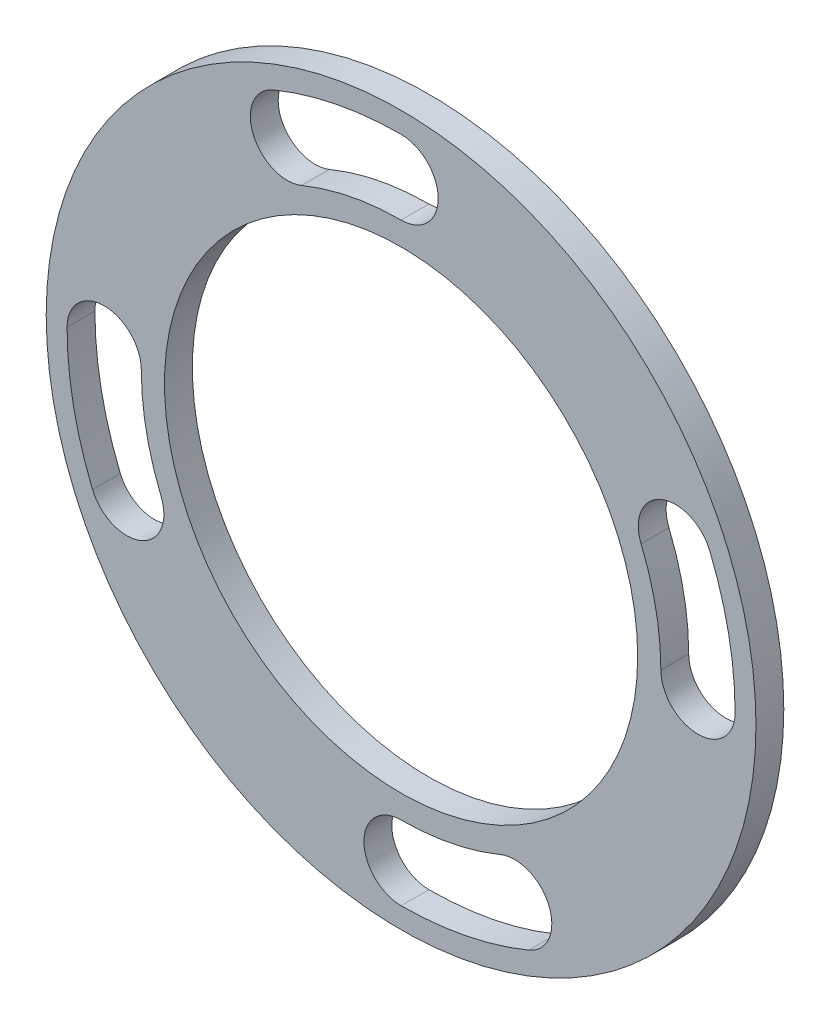
ISO-10303-21;
HEADER;
FILE_DESCRIPTION(('STEP AP214'),'2;1');
FILE_NAME('part.step','',(''),(''),'','','');
FILE_SCHEMA(('AUTOMOTIVE_DESIGN { 1 0 10303 214 1 1 1 1 }'));
ENDSEC;
DATA;
#1=APPLICATION_CONTEXT('core data for automotive mechanical design processes');
#2=APPLICATION_PROTOCOL_DEFINITION('international standard','automotive_design',2000,#1);
#3=PRODUCT_CONTEXT('',#1,'mechanical');
#4=PRODUCT('Part','Part','',(#3));
#5=PRODUCT_RELATED_PRODUCT_CATEGORY('part','',(#4));
#6=PRODUCT_DEFINITION_FORMATION('','',#4);
#7=PRODUCT_DEFINITION_CONTEXT('part definition',#1,'design');
#8=PRODUCT_DEFINITION('design','',#6,#7);
#9=PRODUCT_DEFINITION_SHAPE('','',#8);
#10=(LENGTH_UNIT() NAMED_UNIT(*) SI_UNIT(.MILLI.,.METRE.));
#11=(NAMED_UNIT(*) PLANE_ANGLE_UNIT() SI_UNIT($,.RADIAN.));
#12=(NAMED_UNIT(*) SI_UNIT($,.STERADIAN.) SOLID_ANGLE_UNIT());
#13=UNCERTAINTY_MEASURE_WITH_UNIT(LENGTH_MEASURE(1.E-05),#10,'distance_accuracy_value','');
#14=(GEOMETRIC_REPRESENTATION_CONTEXT(3) GLOBAL_UNCERTAINTY_ASSIGNED_CONTEXT((#13)) GLOBAL_UNIT_ASSIGNED_CONTEXT((#10,
#11,#12)) REPRESENTATION_CONTEXT('',''));
#15=CARTESIAN_POINT('',(0.,0.,0.));
#16=DIRECTION('',(0.,0.,1.));
#17=DIRECTION('',(1.,0.,0.));
#18=AXIS2_PLACEMENT_3D('',#15,#16,#17);
#19=CARTESIAN_POINT('',(0.,0.,0.6));
#20=DIRECTION('',(0.,0.,1.));
#21=DIRECTION('',(1.,0.,0.));
#22=AXIS2_PLACEMENT_3D('',#19,#20,#21);
#23=PLANE('',#22);
#24=CARTESIAN_POINT('',(0.,0.,0.6));
#25=DIRECTION('',(0.,0.,1.));
#26=DIRECTION('',(1.,0.,0.));
#27=AXIS2_PLACEMENT_3D('',#24,#25,#26);
#28=CIRCLE('',#27,7.65);
#29=CARTESIAN_POINT('',(7.65,0.,0.6));
#30=VERTEX_POINT('',#29);
#31=EDGE_CURVE('E11',#30,#30,#28,.T.);
#32=ORIENTED_EDGE('',*,*,#31,.T.);
#33=EDGE_LOOP('',(#32));
#34=FACE_BOUND('',#33,.T.);
#35=CARTESIAN_POINT('',(0.,0.,0.6));
#36=DIRECTION('',(0.,0.,1.));
#37=DIRECTION('',(1.,0.,0.));
#38=AXIS2_PLACEMENT_3D('',#35,#36,#37);
#39=CIRCLE('',#38,5.1);
#40=CARTESIAN_POINT('',(5.1,0.,0.6));
#41=VERTEX_POINT('',#40);
#42=EDGE_CURVE('E276',#41,#41,#39,.T.);
#43=ORIENTED_EDGE('',*,*,#42,.F.);
#44=EDGE_LOOP('',(#43));
#45=FACE_BOUND('',#44,.T.);
#46=CARTESIAN_POINT('',(0.,6.4,0.6));
#47=DIRECTION('',(0.,0.,1.));
#48=DIRECTION('',(1.,0.,0.));
#49=AXIS2_PLACEMENT_3D('',#46,#47,#48);
#50=CIRCLE('',#49,0.800000000000025);
#51=CARTESIAN_POINT('',(0.,5.59999999999997,0.6));
#52=VERTEX_POINT('',#51);
#53=CARTESIAN_POINT('',(0.,7.20000000000064,0.6));
#54=VERTEX_POINT('',#53);
#55=EDGE_CURVE('E247',#52,#54,#50,.T.);
#56=ORIENTED_EDGE('',*,*,#55,.F.);
#57=CARTESIAN_POINT('',(0.,0.,0.6));
#58=DIRECTION('',(0.,0.,-1.));
#59=DIRECTION('',(1.,0.,0.));
#60=AXIS2_PLACEMENT_3D('',#57,#58,#59);
#61=CIRCLE('',#60,5.60000000000057);
#62=CARTESIAN_POINT('',(-2.14302722124451,5.173725382063,0.6));
#63=VERTEX_POINT('',#62);
#64=EDGE_CURVE('E245',#63,#52,#61,.T.);
#65=ORIENTED_EDGE('',*,*,#64,.F.);
#66=CARTESIAN_POINT('',(-2.44917396713655,5.9128290080721,0.6));
#67=DIRECTION('',(0.,0.,1.));
#68=DIRECTION('',(1.,0.,0.));
#69=AXIS2_PLACEMENT_3D('',#66,#67,#68);
#70=CIRCLE('',#69,0.800000000000046);
#71=CARTESIAN_POINT('',(-2.75532071302869,6.65193263408115,0.6));
#72=VERTEX_POINT('',#71);
#73=EDGE_CURVE('E253',#72,#63,#70,.T.);
#74=ORIENTED_EDGE('',*,*,#73,.F.);
#75=CARTESIAN_POINT('',(0.,0.,0.6));
#76=DIRECTION('',(0.,0.,1.));
#77=DIRECTION('',(1.,0.,0.));
#78=AXIS2_PLACEMENT_3D('',#75,#76,#77);
#79=CIRCLE('',#78,7.20000000000064);
#80=EDGE_CURVE('E250',#54,#72,#79,.T.);
#81=ORIENTED_EDGE('',*,*,#80,.F.);
#82=EDGE_LOOP('',(#56,#65,#74,#81));
#83=FACE_BOUND('',#82,.T.);
#84=CARTESIAN_POINT('',(5.91282900807269,2.44917396713695,0.6));
#85=DIRECTION('',(0.,0.,1.));
#86=DIRECTION('',(1.,0.,0.));
#87=AXIS2_PLACEMENT_3D('',#84,#85,#86);
#88=CIRCLE('',#87,0.800000000000009);
#89=CARTESIAN_POINT('',(6.65193263408171,2.75532071302906,0.6));
#90=VERTEX_POINT('',#89);
#91=CARTESIAN_POINT('',(5.17372538206366,2.14302722124487,0.6));
#92=VERTEX_POINT('',#91);
#93=EDGE_CURVE('E216',#90,#92,#88,.T.);
#94=ORIENTED_EDGE('',*,*,#93,.F.);
#95=CARTESIAN_POINT('',(0.,0.,0.6));
#96=DIRECTION('',(0.,0.,1.));
#97=DIRECTION('',(1.,0.,0.));
#98=AXIS2_PLACEMENT_3D('',#95,#96,#97);
#99=CIRCLE('',#98,7.20000000000066);
#100=CARTESIAN_POINT('',(7.20000000000066,3.58609509207387E-13,0.6));
#101=VERTEX_POINT('',#100);
#102=EDGE_CURVE('E214',#101,#90,#99,.T.);
#103=ORIENTED_EDGE('',*,*,#102,.F.);
#104=CARTESIAN_POINT('',(6.40000000000056,3.58609509207387E-13,0.6));
#105=DIRECTION('',(0.,0.,1.));
#106=DIRECTION('',(1.,0.,0.));
#107=AXIS2_PLACEMENT_3D('',#104,#105,#106);
#108=CIRCLE('',#107,0.800000000000101);
#109=CARTESIAN_POINT('',(5.60000000000046,3.13783320556462E-13,0.6));
#110=VERTEX_POINT('',#109);
#111=EDGE_CURVE('E222',#110,#101,#108,.T.);
#112=ORIENTED_EDGE('',*,*,#111,.F.);
#113=CARTESIAN_POINT('',(0.,0.,0.6));
#114=DIRECTION('',(0.,0.,-1.));
#115=DIRECTION('',(1.,0.,0.));
#116=AXIS2_PLACEMENT_3D('',#113,#114,#115);
#117=CIRCLE('',#116,5.60000000000055);
#118=EDGE_CURVE('E219',#92,#110,#117,.T.);
#119=ORIENTED_EDGE('',*,*,#118,.F.);
#120=EDGE_LOOP('',(#94,#103,#112,#119));
#121=FACE_BOUND('',#120,.T.);
#122=CARTESIAN_POINT('',(-5.91282900807169,-2.44917396713714,0.6));
#123=DIRECTION('',(0.,0.,1.));
#124=DIRECTION('',(1.,0.,0.));
#125=AXIS2_PLACEMENT_3D('',#122,#123,#124);
#126=CIRCLE('',#125,0.800000000000163);
#127=CARTESIAN_POINT('',(-6.65193263408079,-2.75532071302948,0.6));
#128=VERTEX_POINT('',#127);
#129=CARTESIAN_POINT('',(-5.17372538206338,-2.14302722124526,0.6));
#130=VERTEX_POINT('',#129);
#131=EDGE_CURVE('E185',#128,#130,#126,.T.);
#132=ORIENTED_EDGE('',*,*,#131,.F.);
#133=CARTESIAN_POINT('',(0.,0.,0.6));
#134=DIRECTION('',(0.,0.,1.));
#135=DIRECTION('',(1.,0.,0.));
#136=AXIS2_PLACEMENT_3D('',#133,#134,#135);
#137=CIRCLE('',#136,7.20000000000072);
#138=CARTESIAN_POINT('',(-7.19999999999976,-6.28046998985927E-13,0.6));
#139=VERTEX_POINT('',#138);
#140=EDGE_CURVE('E183',#139,#128,#137,.T.);
#141=ORIENTED_EDGE('',*,*,#140,.F.);
#142=CARTESIAN_POINT('',(-6.39999999999964,-5.5851178262536E-13,0.6));
#143=DIRECTION('',(0.,0.,1.));
#144=DIRECTION('',(1.,0.,0.));
#145=AXIS2_PLACEMENT_3D('',#142,#143,#144);
#146=CIRCLE('',#145,0.800000000000114);
#147=CARTESIAN_POINT('',(-5.59999999999953,-5.5851178262536E-13,0.6));
#148=VERTEX_POINT('',#147);
#149=EDGE_CURVE('E191',#148,#139,#146,.T.);
#150=ORIENTED_EDGE('',*,*,#149,.F.);
#151=CARTESIAN_POINT('',(0.,0.,0.6));
#152=DIRECTION('',(0.,0.,-1.));
#153=DIRECTION('',(1.,0.,0.));
#154=AXIS2_PLACEMENT_3D('',#151,#152,#153);
#155=CIRCLE('',#154,5.60000000000045);
#156=EDGE_CURVE('E188',#130,#148,#155,.T.);
#157=ORIENTED_EDGE('',*,*,#156,.F.);
#158=EDGE_LOOP('',(#132,#141,#150,#157));
#159=FACE_BOUND('',#158,.T.);
#160=CARTESIAN_POINT('',(9.15962817610477E-13,-6.4000000000002,0.6));
#161=DIRECTION('',(0.,0.,1.));
#162=DIRECTION('',(1.,0.,0.));
#163=AXIS2_PLACEMENT_3D('',#160,#161,#162);
#164=CIRCLE('',#163,0.800000000000045);
#165=CARTESIAN_POINT('',(8.01436787341121E-13,-5.60000000000016,0.6));
#166=VERTEX_POINT('',#165);
#167=CARTESIAN_POINT('',(1.03021324045196E-12,-7.20000000000024,0.6));
#168=VERTEX_POINT('',#167);
#169=EDGE_CURVE('E155',#166,#168,#164,.T.);
#170=ORIENTED_EDGE('',*,*,#169,.F.);
#171=CARTESIAN_POINT('',(0.,0.,0.6));
#172=DIRECTION('',(0.,0.,-1.));
#173=DIRECTION('',(1.,0.,0.));
#174=AXIS2_PLACEMENT_3D('',#171,#172,#173);
#175=CIRCLE('',#174,5.60000000000052);
#176=CARTESIAN_POINT('',(2.14302722124531,-5.17372538206324,0.6));
#177=VERTEX_POINT('',#176);
#178=EDGE_CURVE('E147',#177,#166,#175,.T.);
#179=ORIENTED_EDGE('',*,*,#178,.F.);
#180=CARTESIAN_POINT('',(2.44917396713749,-5.91282900807225,0.6));
#181=DIRECTION('',(0.,0.,1.));
#182=DIRECTION('',(1.,0.,0.));
#183=AXIS2_PLACEMENT_3D('',#180,#181,#182);
#184=CIRCLE('',#183,0.800000000000027);
#185=CARTESIAN_POINT('',(2.75532071302967,-6.65193263408127,0.6));
#186=VERTEX_POINT('',#185);
#187=EDGE_CURVE('E169',#186,#177,#184,.T.);
#188=ORIENTED_EDGE('',*,*,#187,.F.);
#189=CARTESIAN_POINT('',(0.,0.,0.6));
#190=DIRECTION('',(0.,0.,1.));
#191=DIRECTION('',(1.,0.,0.));
#192=AXIS2_PLACEMENT_3D('',#189,#190,#191);
#193=CIRCLE('',#192,7.20000000000059);
#194=EDGE_CURVE('E167',#168,#186,#193,.T.);
#195=ORIENTED_EDGE('',*,*,#194,.F.);
#196=EDGE_LOOP('',(#170,#179,#188,#195));
#197=FACE_BOUND('',#196,.T.);
#198=ADVANCED_FACE('F34',(#34,#45,#83,#121,#159,#197),#23,.T.);
#199=CARTESIAN_POINT('',(0.,0.,0.));
#200=DIRECTION('',(0.,0.,1.));
#201=DIRECTION('',(1.,0.,0.));
#202=AXIS2_PLACEMENT_3D('',#199,#200,#201);
#203=PLANE('',#202);
#204=CARTESIAN_POINT('',(0.,0.,0.));
#205=DIRECTION('',(0.,0.,1.));
#206=DIRECTION('',(1.,0.,0.));
#207=AXIS2_PLACEMENT_3D('',#204,#205,#206);
#208=CIRCLE('',#207,7.20000000000072);
#209=CARTESIAN_POINT('',(-7.19999999999976,-6.28046998985927E-13,0.));
#210=VERTEX_POINT('',#209);
#211=CARTESIAN_POINT('',(-6.65193263408079,-2.75532071302948,0.));
#212=VERTEX_POINT('',#211);
#213=EDGE_CURVE('E163',#210,#212,#208,.T.);
#214=ORIENTED_EDGE('',*,*,#213,.T.);
#215=CARTESIAN_POINT('',(-5.91282900807169,-2.44917396713714,0.));
#216=DIRECTION('',(0.,0.,1.));
#217=DIRECTION('',(1.,0.,0.));
#218=AXIS2_PLACEMENT_3D('',#215,#216,#217);
#219=CIRCLE('',#218,0.800000000000163);
#220=CARTESIAN_POINT('',(-5.17372538206338,-2.14302722124526,0.));
#221=VERTEX_POINT('',#220);
#222=EDGE_CURVE('E196',#212,#221,#219,.T.);
#223=ORIENTED_EDGE('',*,*,#222,.T.);
#224=CARTESIAN_POINT('',(0.,0.,0.));
#225=DIRECTION('',(0.,0.,-1.));
#226=DIRECTION('',(1.,0.,0.));
#227=AXIS2_PLACEMENT_3D('',#224,#225,#226);
#228=CIRCLE('',#227,5.60000000000045);
#229=CARTESIAN_POINT('',(-5.59999999999953,-4.88697809797176E-13,0.));
#230=VERTEX_POINT('',#229);
#231=EDGE_CURVE('E199',#221,#230,#228,.T.);
#232=ORIENTED_EDGE('',*,*,#231,.T.);
#233=CARTESIAN_POINT('',(-6.39999999999964,-5.5851178262536E-13,0.));
#234=DIRECTION('',(0.,0.,1.));
#235=DIRECTION('',(1.,0.,0.));
#236=AXIS2_PLACEMENT_3D('',#233,#234,#235);
#237=CIRCLE('',#236,0.800000000000114);
#238=EDGE_CURVE('E186',#230,#210,#237,.T.);
#239=ORIENTED_EDGE('',*,*,#238,.T.);
#240=EDGE_LOOP('',(#214,#223,#232,#239));
#241=FACE_BOUND('',#240,.T.);
#242=CARTESIAN_POINT('',(0.,0.,0.));
#243=DIRECTION('',(0.,0.,-1.));
#244=DIRECTION('',(1.,0.,0.));
#245=AXIS2_PLACEMENT_3D('',#242,#243,#244);
#246=CIRCLE('',#245,5.60000000000057);
#247=CARTESIAN_POINT('',(-2.14302722124451,5.173725382063,0.));
#248=VERTEX_POINT('',#247);
#249=CARTESIAN_POINT('',(0.,5.59999999999997,0.));
#250=VERTEX_POINT('',#249);
#251=EDGE_CURVE('E244',#248,#250,#246,.T.);
#252=ORIENTED_EDGE('',*,*,#251,.T.);
#253=CARTESIAN_POINT('',(0.,6.4,0.));
#254=DIRECTION('',(0.,0.,1.));
#255=DIRECTION('',(1.,0.,0.));
#256=AXIS2_PLACEMENT_3D('',#253,#254,#255);
#257=CIRCLE('',#256,0.800000000000025);
#258=CARTESIAN_POINT('',(0.,7.20000000000064,0.));
#259=VERTEX_POINT('',#258);
#260=EDGE_CURVE('E258',#250,#259,#257,.T.);
#261=ORIENTED_EDGE('',*,*,#260,.T.);
#262=CARTESIAN_POINT('',(0.,0.,0.));
#263=DIRECTION('',(0.,0.,1.));
#264=DIRECTION('',(1.,0.,0.));
#265=AXIS2_PLACEMENT_3D('',#262,#263,#264);
#266=CIRCLE('',#265,7.20000000000064);
#267=CARTESIAN_POINT('',(-2.75532071302869,6.65193263408115,0.));
#268=VERTEX_POINT('',#267);
#269=EDGE_CURVE('E261',#259,#268,#266,.T.);
#270=ORIENTED_EDGE('',*,*,#269,.T.);
#271=CARTESIAN_POINT('',(-2.44917396713655,5.9128290080721,0.));
#272=DIRECTION('',(0.,0.,1.));
#273=DIRECTION('',(1.,0.,0.));
#274=AXIS2_PLACEMENT_3D('',#271,#272,#273);
#275=CIRCLE('',#274,0.800000000000046);
#276=EDGE_CURVE('E248',#268,#248,#275,.T.);
#277=ORIENTED_EDGE('',*,*,#276,.T.);
#278=EDGE_LOOP('',(#252,#261,#270,#277));
#279=FACE_BOUND('',#278,.T.);
#280=CARTESIAN_POINT('',(0.,0.,0.));
#281=DIRECTION('',(0.,0.,1.));
#282=DIRECTION('',(1.,0.,0.));
#283=AXIS2_PLACEMENT_3D('',#280,#281,#282);
#284=CIRCLE('',#283,7.65);
#285=CARTESIAN_POINT('',(7.65,0.,0.));
#286=VERTEX_POINT('',#285);
#287=EDGE_CURVE('E38',#286,#286,#284,.T.);
#288=ORIENTED_EDGE('',*,*,#287,.F.);
#289=EDGE_LOOP('',(#288));
#290=FACE_BOUND('',#289,.T.);
#291=CARTESIAN_POINT('',(0.,0.,0.));
#292=DIRECTION('',(0.,0.,1.));
#293=DIRECTION('',(1.,0.,0.));
#294=AXIS2_PLACEMENT_3D('',#291,#292,#293);
#295=CIRCLE('',#294,5.1);
#296=CARTESIAN_POINT('',(5.1,0.,0.));
#297=VERTEX_POINT('',#296);
#298=EDGE_CURVE('E275',#297,#297,#295,.T.);
#299=ORIENTED_EDGE('',*,*,#298,.T.);
#300=EDGE_LOOP('',(#299));
#301=FACE_BOUND('',#300,.T.);
#302=CARTESIAN_POINT('',(0.,0.,0.));
#303=DIRECTION('',(0.,0.,1.));
#304=DIRECTION('',(1.,0.,0.));
#305=AXIS2_PLACEMENT_3D('',#302,#303,#304);
#306=CIRCLE('',#305,7.20000000000066);
#307=CARTESIAN_POINT('',(7.20000000000066,3.58609509207387E-13,0.));
#308=VERTEX_POINT('',#307);
#309=CARTESIAN_POINT('',(6.65193263408171,2.75532071302906,0.));
#310=VERTEX_POINT('',#309);
#311=EDGE_CURVE('E213',#308,#310,#306,.T.);
#312=ORIENTED_EDGE('',*,*,#311,.T.);
#313=CARTESIAN_POINT('',(5.91282900807269,2.44917396713695,0.));
#314=DIRECTION('',(0.,0.,1.));
#315=DIRECTION('',(1.,0.,0.));
#316=AXIS2_PLACEMENT_3D('',#313,#314,#315);
#317=CIRCLE('',#316,0.800000000000009);
#318=CARTESIAN_POINT('',(5.17372538206366,2.14302722124487,0.));
#319=VERTEX_POINT('',#318);
#320=EDGE_CURVE('E227',#310,#319,#317,.T.);
#321=ORIENTED_EDGE('',*,*,#320,.T.);
#322=CARTESIAN_POINT('',(0.,0.,0.));
#323=DIRECTION('',(0.,0.,-1.));
#324=DIRECTION('',(1.,0.,0.));
#325=AXIS2_PLACEMENT_3D('',#322,#323,#324);
#326=CIRCLE('',#325,5.60000000000055);
#327=CARTESIAN_POINT('',(5.60000000000055,3.13783320556467E-13,0.));
#328=VERTEX_POINT('',#327);
#329=EDGE_CURVE('E230',#319,#328,#326,.T.);
#330=ORIENTED_EDGE('',*,*,#329,.T.);
#331=CARTESIAN_POINT('',(6.40000000000056,3.58609509207387E-13,0.));
#332=DIRECTION('',(0.,0.,1.));
#333=DIRECTION('',(1.,0.,0.));
#334=AXIS2_PLACEMENT_3D('',#331,#332,#333);
#335=CIRCLE('',#334,0.800000000000101);
#336=EDGE_CURVE('E217',#328,#308,#335,.T.);
#337=ORIENTED_EDGE('',*,*,#336,.T.);
#338=EDGE_LOOP('',(#312,#321,#330,#337));
#339=FACE_BOUND('',#338,.T.);
#340=CARTESIAN_POINT('',(0.,0.,0.));
#341=DIRECTION('',(0.,0.,-1.));
#342=DIRECTION('',(1.,0.,0.));
#343=AXIS2_PLACEMENT_3D('',#340,#341,#342);
#344=CIRCLE('',#343,5.60000000000052);
#345=CARTESIAN_POINT('',(2.14302722124531,-5.17372538206324,0.));
#346=VERTEX_POINT('',#345);
#347=CARTESIAN_POINT('',(8.01436787341121E-13,-5.60000000000016,0.));
#348=VERTEX_POINT('',#347);
#349=EDGE_CURVE('E57',#346,#348,#344,.T.);
#350=ORIENTED_EDGE('',*,*,#349,.T.);
#351=CARTESIAN_POINT('',(9.15962817610477E-13,-6.4000000000002,0.));
#352=DIRECTION('',(0.,0.,1.));
#353=DIRECTION('',(1.,0.,0.));
#354=AXIS2_PLACEMENT_3D('',#351,#352,#353);
#355=CIRCLE('',#354,0.800000000000045);
#356=CARTESIAN_POINT('',(1.03021324045196E-12,-7.20000000000024,0.));
#357=VERTEX_POINT('',#356);
#358=EDGE_CURVE('E162',#348,#357,#355,.T.);
#359=ORIENTED_EDGE('',*,*,#358,.T.);
#360=CARTESIAN_POINT('',(0.,0.,0.));
#361=DIRECTION('',(0.,0.,1.));
#362=DIRECTION('',(1.,0.,0.));
#363=AXIS2_PLACEMENT_3D('',#360,#361,#362);
#364=CIRCLE('',#363,7.20000000000059);
#365=CARTESIAN_POINT('',(2.75532071302975,-6.65193263408145,0.));
#366=VERTEX_POINT('',#365);
#367=EDGE_CURVE('E175',#357,#366,#364,.T.);
#368=ORIENTED_EDGE('',*,*,#367,.T.);
#369=CARTESIAN_POINT('',(2.44917396713749,-5.91282900807225,0.));
#370=DIRECTION('',(0.,0.,1.));
#371=DIRECTION('',(1.,0.,0.));
#372=AXIS2_PLACEMENT_3D('',#369,#370,#371);
#373=CIRCLE('',#372,0.800000000000027);
#374=EDGE_CURVE('E156',#366,#346,#373,.T.);
#375=ORIENTED_EDGE('',*,*,#374,.T.);
#376=EDGE_LOOP('',(#350,#359,#368,#375));
#377=FACE_BOUND('',#376,.T.);
#378=ADVANCED_FACE('F282',(#241,#279,#290,#301,#339,#377),#203,.F.);
#379=CARTESIAN_POINT('',(0.,0.,0.6));
#380=DIRECTION('',(0.,0.,-1.));
#381=DIRECTION('',(-1.,0.,0.));
#382=AXIS2_PLACEMENT_3D('',#379,#380,#381);
#383=CYLINDRICAL_SURFACE('',#382,7.65);
#384=ORIENTED_EDGE('',*,*,#31,.F.);
#385=EDGE_LOOP('',(#384));
#386=FACE_BOUND('',#385,.T.);
#387=ORIENTED_EDGE('',*,*,#287,.T.);
#388=EDGE_LOOP('',(#387));
#389=FACE_BOUND('',#388,.T.);
#390=ADVANCED_FACE('F36',(#386,#389),#383,.T.);
#391=CARTESIAN_POINT('',(0.,0.,0.6));
#392=DIRECTION('',(0.,0.,-1.));
#393=DIRECTION('',(-1.,0.,0.));
#394=AXIS2_PLACEMENT_3D('',#391,#392,#393);
#395=CYLINDRICAL_SURFACE('',#394,5.1);
#396=ORIENTED_EDGE('',*,*,#42,.T.);
#397=EDGE_LOOP('',(#396));
#398=FACE_BOUND('',#397,.T.);
#399=ORIENTED_EDGE('',*,*,#298,.F.);
#400=EDGE_LOOP('',(#399));
#401=FACE_BOUND('',#400,.T.);
#402=ADVANCED_FACE('F285',(#398,#401),#395,.F.);
#403=CARTESIAN_POINT('',(0.,0.,0.6));
#404=DIRECTION('',(0.,0.,-1.));
#405=DIRECTION('',(-1.,0.,0.));
#406=AXIS2_PLACEMENT_3D('',#403,#404,#405);
#407=CYLINDRICAL_SURFACE('',#406,5.60000000000057);
#408=ORIENTED_EDGE('',*,*,#251,.F.);
#409=DIRECTION('',(0.,0.,-1.));
#410=VECTOR('',#409,1.);
#411=CARTESIAN_POINT('',(-2.14302722124451,5.173725382063,0.6));
#412=LINE('',#411,#410);
#413=EDGE_CURVE('E255',#63,#248,#412,.T.);
#414=ORIENTED_EDGE('',*,*,#413,.F.);
#415=ORIENTED_EDGE('',*,*,#64,.T.);
#416=DIRECTION('',(0.,0.,-1.));
#417=VECTOR('',#416,1.);
#418=CARTESIAN_POINT('',(0.,5.59999999999997,0.6));
#419=LINE('',#418,#417);
#420=EDGE_CURVE('E272',#52,#250,#419,.T.);
#421=ORIENTED_EDGE('',*,*,#420,.T.);
#422=EDGE_LOOP('',(#408,#414,#415,#421));
#423=FACE_BOUND('',#422,.T.);
#424=ADVANCED_FACE('F287',(#423),#407,.T.);
#425=CARTESIAN_POINT('',(0.,6.4,0.6));
#426=DIRECTION('',(0.,0.,-1.));
#427=DIRECTION('',(-1.,0.,0.));
#428=AXIS2_PLACEMENT_3D('',#425,#426,#427);
#429=CYLINDRICAL_SURFACE('',#428,0.800000000000025);
#430=ORIENTED_EDGE('',*,*,#260,.F.);
#431=ORIENTED_EDGE('',*,*,#420,.F.);
#432=ORIENTED_EDGE('',*,*,#55,.T.);
#433=DIRECTION('',(0.,0.,-1.));
#434=VECTOR('',#433,1.);
#435=CARTESIAN_POINT('',(0.,7.20000000000064,0.6));
#436=LINE('',#435,#434);
#437=EDGE_CURVE('E270',#54,#259,#436,.T.);
#438=ORIENTED_EDGE('',*,*,#437,.T.);
#439=EDGE_LOOP('',(#430,#431,#432,#438));
#440=FACE_BOUND('',#439,.T.);
#441=ADVANCED_FACE('F294',(#440),#429,.F.);
#442=CARTESIAN_POINT('',(0.,0.,0.6));
#443=DIRECTION('',(0.,0.,-1.));
#444=DIRECTION('',(-1.,0.,0.));
#445=AXIS2_PLACEMENT_3D('',#442,#443,#444);
#446=CYLINDRICAL_SURFACE('',#445,7.20000000000064);
#447=ORIENTED_EDGE('',*,*,#269,.F.);
#448=ORIENTED_EDGE('',*,*,#437,.F.);
#449=ORIENTED_EDGE('',*,*,#80,.T.);
#450=DIRECTION('',(0.,0.,-1.));
#451=VECTOR('',#450,1.);
#452=CARTESIAN_POINT('',(-2.75532071302869,6.65193263408115,0.6));
#453=LINE('',#452,#451);
#454=EDGE_CURVE('E268',#72,#268,#453,.T.);
#455=ORIENTED_EDGE('',*,*,#454,.T.);
#456=EDGE_LOOP('',(#447,#448,#449,#455));
#457=FACE_BOUND('',#456,.T.);
#458=ADVANCED_FACE('F368',(#457),#446,.F.);
#459=CARTESIAN_POINT('',(-2.44917396713655,5.9128290080721,0.6));
#460=DIRECTION('',(0.,0.,-1.));
#461=DIRECTION('',(-1.,0.,0.));
#462=AXIS2_PLACEMENT_3D('',#459,#460,#461);
#463=CYLINDRICAL_SURFACE('',#462,0.800000000000046);
#464=ORIENTED_EDGE('',*,*,#276,.F.);
#465=ORIENTED_EDGE('',*,*,#454,.F.);
#466=ORIENTED_EDGE('',*,*,#73,.T.);
#467=ORIENTED_EDGE('',*,*,#413,.T.);
#468=EDGE_LOOP('',(#464,#465,#466,#467));
#469=FACE_BOUND('',#468,.T.);
#470=ADVANCED_FACE('F364',(#469),#463,.F.);
#471=CARTESIAN_POINT('',(0.,0.,0.6));
#472=DIRECTION('',(0.,0.,-1.));
#473=DIRECTION('',(-1.,0.,0.));
#474=AXIS2_PLACEMENT_3D('',#471,#472,#473);
#475=CYLINDRICAL_SURFACE('',#474,7.20000000000066);
#476=ORIENTED_EDGE('',*,*,#311,.F.);
#477=DIRECTION('',(0.,0.,-1.));
#478=VECTOR('',#477,1.);
#479=CARTESIAN_POINT('',(7.20000000000066,3.58609509207387E-13,0.6));
#480=LINE('',#479,#478);
#481=EDGE_CURVE('E224',#101,#308,#480,.T.);
#482=ORIENTED_EDGE('',*,*,#481,.F.);
#483=ORIENTED_EDGE('',*,*,#102,.T.);
#484=DIRECTION('',(0.,0.,-1.));
#485=VECTOR('',#484,1.);
#486=CARTESIAN_POINT('',(6.65193263408171,2.75532071302906,0.6));
#487=LINE('',#486,#485);
#488=EDGE_CURVE('E241',#90,#310,#487,.T.);
#489=ORIENTED_EDGE('',*,*,#488,.T.);
#490=EDGE_LOOP('',(#476,#482,#483,#489));
#491=FACE_BOUND('',#490,.T.);
#492=ADVANCED_FACE('F360',(#491),#475,.F.);
#493=CARTESIAN_POINT('',(5.91282900807269,2.44917396713695,0.6));
#494=DIRECTION('',(0.,0.,-1.));
#495=DIRECTION('',(-1.,0.,0.));
#496=AXIS2_PLACEMENT_3D('',#493,#494,#495);
#497=CYLINDRICAL_SURFACE('',#496,0.800000000000009);
#498=ORIENTED_EDGE('',*,*,#320,.F.);
#499=ORIENTED_EDGE('',*,*,#488,.F.);
#500=ORIENTED_EDGE('',*,*,#93,.T.);
#501=DIRECTION('',(0.,0.,-1.));
#502=VECTOR('',#501,1.);
#503=CARTESIAN_POINT('',(5.17372538206366,2.14302722124487,0.6));
#504=LINE('',#503,#502);
#505=EDGE_CURVE('E239',#92,#319,#504,.T.);
#506=ORIENTED_EDGE('',*,*,#505,.T.);
#507=EDGE_LOOP('',(#498,#499,#500,#506));
#508=FACE_BOUND('',#507,.T.);
#509=ADVANCED_FACE('F356',(#508),#497,.F.);
#510=CARTESIAN_POINT('',(0.,0.,0.6));
#511=DIRECTION('',(0.,0.,-1.));
#512=DIRECTION('',(-1.,0.,0.));
#513=AXIS2_PLACEMENT_3D('',#510,#511,#512);
#514=CYLINDRICAL_SURFACE('',#513,5.60000000000055);
#515=ORIENTED_EDGE('',*,*,#329,.F.);
#516=ORIENTED_EDGE('',*,*,#505,.F.);
#517=ORIENTED_EDGE('',*,*,#118,.T.);
#518=DIRECTION('',(0.,0.,-1.));
#519=VECTOR('',#518,1.);
#520=CARTESIAN_POINT('',(5.60000000000055,3.13783320556467E-13,0.6));
#521=LINE('',#520,#519);
#522=EDGE_CURVE('E237',#110,#328,#521,.T.);
#523=ORIENTED_EDGE('',*,*,#522,.T.);
#524=EDGE_LOOP('',(#515,#516,#517,#523));
#525=FACE_BOUND('',#524,.T.);
#526=ADVANCED_FACE('F352',(#525),#514,.T.);
#527=CARTESIAN_POINT('',(6.40000000000056,3.58609509207387E-13,0.6));
#528=DIRECTION('',(0.,0.,-1.));
#529=DIRECTION('',(-1.,0.,0.));
#530=AXIS2_PLACEMENT_3D('',#527,#528,#529);
#531=CYLINDRICAL_SURFACE('',#530,0.800000000000101);
#532=ORIENTED_EDGE('',*,*,#336,.F.);
#533=ORIENTED_EDGE('',*,*,#522,.F.);
#534=ORIENTED_EDGE('',*,*,#111,.T.);
#535=ORIENTED_EDGE('',*,*,#481,.T.);
#536=EDGE_LOOP('',(#532,#533,#534,#535));
#537=FACE_BOUND('',#536,.T.);
#538=ADVANCED_FACE('F349',(#537),#531,.F.);
#539=CARTESIAN_POINT('',(0.,0.,0.6));
#540=DIRECTION('',(0.,0.,-1.));
#541=DIRECTION('',(-1.,0.,0.));
#542=AXIS2_PLACEMENT_3D('',#539,#540,#541);
#543=CYLINDRICAL_SURFACE('',#542,7.20000000000072);
#544=ORIENTED_EDGE('',*,*,#213,.F.);
#545=DIRECTION('',(0.,0.,-1.));
#546=VECTOR('',#545,1.);
#547=CARTESIAN_POINT('',(-7.19999999999976,-6.28046998985927E-13,0.6));
#548=LINE('',#547,#546);
#549=EDGE_CURVE('E193',#139,#210,#548,.T.);
#550=ORIENTED_EDGE('',*,*,#549,.F.);
#551=ORIENTED_EDGE('',*,*,#140,.T.);
#552=DIRECTION('',(0.,0.,-1.));
#553=VECTOR('',#552,1.);
#554=CARTESIAN_POINT('',(-6.65193263408079,-2.75532071302948,0.6));
#555=LINE('',#554,#553);
#556=EDGE_CURVE('E210',#128,#212,#555,.T.);
#557=ORIENTED_EDGE('',*,*,#556,.T.);
#558=EDGE_LOOP('',(#544,#550,#551,#557));
#559=FACE_BOUND('',#558,.T.);
#560=ADVANCED_FACE('F331',(#559),#543,.F.);
#561=CARTESIAN_POINT('',(-5.91282900807169,-2.44917396713714,0.6));
#562=DIRECTION('',(0.,0.,-1.));
#563=DIRECTION('',(-1.,0.,0.));
#564=AXIS2_PLACEMENT_3D('',#561,#562,#563);
#565=CYLINDRICAL_SURFACE('',#564,0.800000000000163);
#566=ORIENTED_EDGE('',*,*,#222,.F.);
#567=ORIENTED_EDGE('',*,*,#556,.F.);
#568=ORIENTED_EDGE('',*,*,#131,.T.);
#569=DIRECTION('',(0.,0.,-1.));
#570=VECTOR('',#569,1.);
#571=CARTESIAN_POINT('',(-5.17372538206338,-2.14302722124526,0.6));
#572=LINE('',#571,#570);
#573=EDGE_CURVE('E208',#130,#221,#572,.T.);
#574=ORIENTED_EDGE('',*,*,#573,.T.);
#575=EDGE_LOOP('',(#566,#567,#568,#574));
#576=FACE_BOUND('',#575,.T.);
#577=ADVANCED_FACE('F324',(#576),#565,.F.);
#578=CARTESIAN_POINT('',(0.,0.,0.6));
#579=DIRECTION('',(0.,0.,-1.));
#580=DIRECTION('',(-1.,0.,0.));
#581=AXIS2_PLACEMENT_3D('',#578,#579,#580);
#582=CYLINDRICAL_SURFACE('',#581,5.60000000000045);
#583=ORIENTED_EDGE('',*,*,#231,.F.);
#584=ORIENTED_EDGE('',*,*,#573,.F.);
#585=ORIENTED_EDGE('',*,*,#156,.T.);
#586=DIRECTION('',(0.,0.,-1.));
#587=VECTOR('',#586,1.);
#588=CARTESIAN_POINT('',(-5.59999999999953,-4.88697809797176E-13,0.6));
#589=LINE('',#588,#587);
#590=EDGE_CURVE('E206',#148,#230,#589,.T.);
#591=ORIENTED_EDGE('',*,*,#590,.T.);
#592=EDGE_LOOP('',(#583,#584,#585,#591));
#593=FACE_BOUND('',#592,.T.);
#594=ADVANCED_FACE('F327',(#593),#582,.T.);
#595=CARTESIAN_POINT('',(-6.39999999999964,-5.5851178262536E-13,0.6));
#596=DIRECTION('',(0.,0.,-1.));
#597=DIRECTION('',(-1.,0.,0.));
#598=AXIS2_PLACEMENT_3D('',#595,#596,#597);
#599=CYLINDRICAL_SURFACE('',#598,0.800000000000114);
#600=ORIENTED_EDGE('',*,*,#238,.F.);
#601=ORIENTED_EDGE('',*,*,#590,.F.);
#602=ORIENTED_EDGE('',*,*,#149,.T.);
#603=ORIENTED_EDGE('',*,*,#549,.T.);
#604=EDGE_LOOP('',(#600,#601,#602,#603));
#605=FACE_BOUND('',#604,.T.);
#606=ADVANCED_FACE('F334',(#605),#599,.F.);
#607=CARTESIAN_POINT('',(0.,0.,0.6));
#608=DIRECTION('',(0.,0.,-1.));
#609=DIRECTION('',(-1.,0.,0.));
#610=AXIS2_PLACEMENT_3D('',#607,#608,#609);
#611=CYLINDRICAL_SURFACE('',#610,5.60000000000052);
#612=ORIENTED_EDGE('',*,*,#349,.F.);
#613=DIRECTION('',(0.,0.,-1.));
#614=VECTOR('',#613,1.);
#615=CARTESIAN_POINT('',(2.14302722124531,-5.17372538206324,0.6));
#616=LINE('',#615,#614);
#617=EDGE_CURVE('E151',#177,#346,#616,.T.);
#618=ORIENTED_EDGE('',*,*,#617,.F.);
#619=ORIENTED_EDGE('',*,*,#178,.T.);
#620=DIRECTION('',(0.,0.,-1.));
#621=VECTOR('',#620,1.);
#622=CARTESIAN_POINT('',(8.01436787341121E-13,-5.60000000000016,0.6));
#623=LINE('',#622,#621);
#624=EDGE_CURVE('E150',#166,#348,#623,.T.);
#625=ORIENTED_EDGE('',*,*,#624,.T.);
#626=EDGE_LOOP('',(#612,#618,#619,#625));
#627=FACE_BOUND('',#626,.T.);
#628=ADVANCED_FACE('F149',(#627),#611,.T.);
#629=CARTESIAN_POINT('',(9.15962817610477E-13,-6.4000000000002,0.6));
#630=DIRECTION('',(0.,0.,-1.));
#631=DIRECTION('',(-1.,0.,0.));
#632=AXIS2_PLACEMENT_3D('',#629,#630,#631);
#633=CYLINDRICAL_SURFACE('',#632,0.800000000000045);
#634=ORIENTED_EDGE('',*,*,#358,.F.);
#635=ORIENTED_EDGE('',*,*,#624,.F.);
#636=ORIENTED_EDGE('',*,*,#169,.T.);
#637=DIRECTION('',(0.,0.,-1.));
#638=VECTOR('',#637,1.);
#639=CARTESIAN_POINT('',(1.03021324045196E-12,-7.20000000000024,0.6));
#640=LINE('',#639,#638);
#641=EDGE_CURVE('E164',#168,#357,#640,.T.);
#642=ORIENTED_EDGE('',*,*,#641,.T.);
#643=EDGE_LOOP('',(#634,#635,#636,#642));
#644=FACE_BOUND('',#643,.T.);
#645=ADVANCED_FACE('F159',(#644),#633,.F.);
#646=CARTESIAN_POINT('',(0.,0.,0.6));
#647=DIRECTION('',(0.,0.,-1.));
#648=DIRECTION('',(-1.,0.,0.));
#649=AXIS2_PLACEMENT_3D('',#646,#647,#648);
#650=CYLINDRICAL_SURFACE('',#649,7.20000000000059);
#651=ORIENTED_EDGE('',*,*,#367,.F.);
#652=ORIENTED_EDGE('',*,*,#641,.F.);
#653=ORIENTED_EDGE('',*,*,#194,.T.);
#654=DIRECTION('',(0.,0.,-1.));
#655=VECTOR('',#654,1.);
#656=CARTESIAN_POINT('',(2.75532071302975,-6.65193263408145,0.6));
#657=LINE('',#656,#655);
#658=EDGE_CURVE('E49',#186,#366,#657,.T.);
#659=ORIENTED_EDGE('',*,*,#658,.T.);
#660=EDGE_LOOP('',(#651,#652,#653,#659));
#661=FACE_BOUND('',#660,.T.);
#662=ADVANCED_FACE('F444',(#661),#650,.F.);
#663=CARTESIAN_POINT('',(2.44917396713749,-5.91282900807225,0.6));
#664=DIRECTION('',(0.,0.,-1.));
#665=DIRECTION('',(-1.,0.,0.));
#666=AXIS2_PLACEMENT_3D('',#663,#664,#665);
#667=CYLINDRICAL_SURFACE('',#666,0.800000000000027);
#668=ORIENTED_EDGE('',*,*,#374,.F.);
#669=ORIENTED_EDGE('',*,*,#658,.F.);
#670=ORIENTED_EDGE('',*,*,#187,.T.);
#671=ORIENTED_EDGE('',*,*,#617,.T.);
#672=EDGE_LOOP('',(#668,#669,#670,#671));
#673=FACE_BOUND('',#672,.T.);
#674=ADVANCED_FACE('F452',(#673),#667,.F.);
#675=CLOSED_SHELL('',(#198,#378,#390,#402,#424,#441,#458,#470,#492,#509,#526,#538,#560,#577,
#594,#606,#628,#645,#662,#674));
#676=MANIFOLD_SOLID_BREP('B2',#675);
#677=ADVANCED_BREP_SHAPE_REPRESENTATION('',(#18,#676),#14);
#678=SHAPE_DEFINITION_REPRESENTATION(#9,#677);
ENDSEC;
END-ISO-10303-21;
